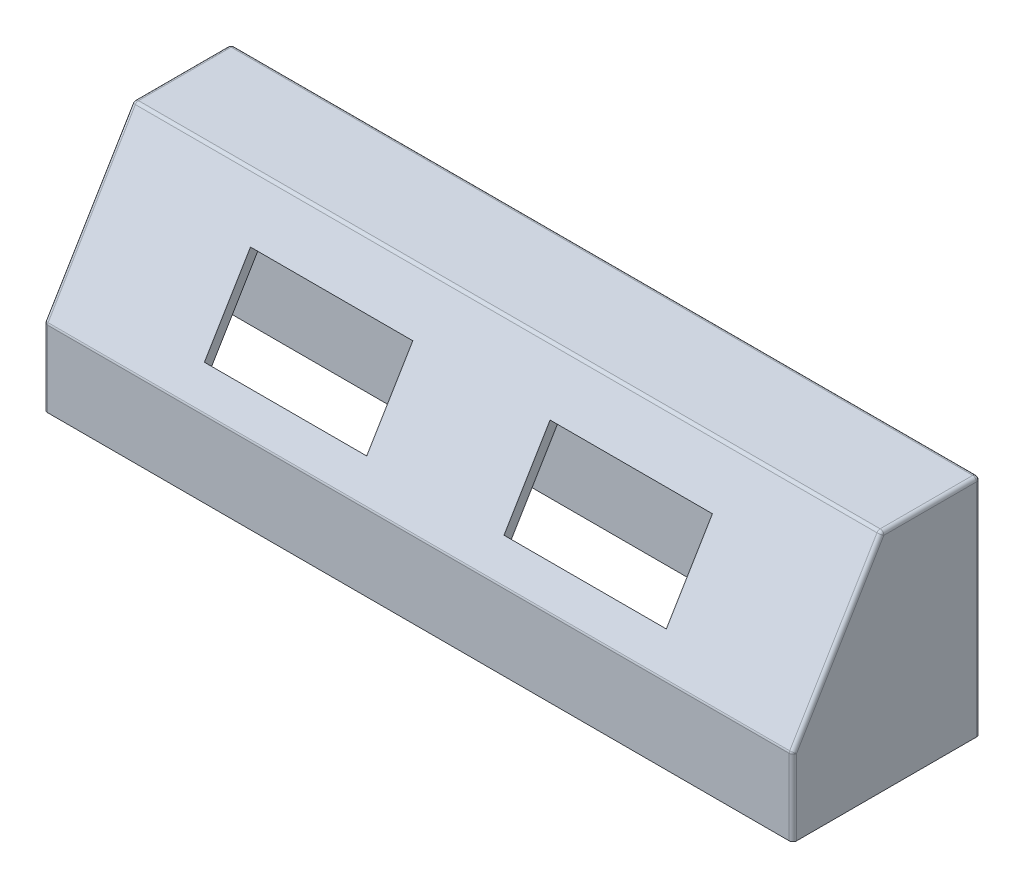
ISO-10303-21;
HEADER;
FILE_DESCRIPTION(('STEP AP214'),'2;1');
FILE_NAME('part.step','',(''),(''),'','','');
FILE_SCHEMA(('AUTOMOTIVE_DESIGN { 1 0 10303 214 1 1 1 1 }'));
ENDSEC;
DATA;
#1=APPLICATION_CONTEXT('core data for automotive mechanical design processes');
#2=APPLICATION_PROTOCOL_DEFINITION('international standard','automotive_design',2000,#1);
#3=PRODUCT_CONTEXT('',#1,'mechanical');
#4=PRODUCT('Part','Part','',(#3));
#5=PRODUCT_RELATED_PRODUCT_CATEGORY('part','',(#4));
#6=PRODUCT_DEFINITION_FORMATION('','',#4);
#7=PRODUCT_DEFINITION_CONTEXT('part definition',#1,'design');
#8=PRODUCT_DEFINITION('design','',#6,#7);
#9=PRODUCT_DEFINITION_SHAPE('','',#8);
#10=(LENGTH_UNIT() NAMED_UNIT(*) SI_UNIT(.MILLI.,.METRE.));
#11=(NAMED_UNIT(*) PLANE_ANGLE_UNIT() SI_UNIT($,.RADIAN.));
#12=(NAMED_UNIT(*) SI_UNIT($,.STERADIAN.) SOLID_ANGLE_UNIT());
#13=UNCERTAINTY_MEASURE_WITH_UNIT(LENGTH_MEASURE(1.E-05),#10,'distance_accuracy_value','');
#14=(GEOMETRIC_REPRESENTATION_CONTEXT(3) GLOBAL_UNCERTAINTY_ASSIGNED_CONTEXT((#13)) GLOBAL_UNIT_ASSIGNED_CONTEXT((#10,
#11,#12)) REPRESENTATION_CONTEXT('',''));
#15=CARTESIAN_POINT('',(0.,0.,0.));
#16=DIRECTION('',(0.,0.,1.));
#17=DIRECTION('',(1.,0.,0.));
#18=AXIS2_PLACEMENT_3D('',#15,#16,#17);
#19=CARTESIAN_POINT('',(76.2,45.72,-19.05));
#20=DIRECTION('',(-1.,0.,0.));
#21=DIRECTION('',(0.,0.,1.));
#22=AXIS2_PLACEMENT_3D('',#19,#20,#21);
#23=PLANE('',#22);
#24=DIRECTION('',(0.,0.,-1.));
#25=VECTOR('',#24,1.);
#26=CARTESIAN_POINT('',(76.2,0.,-19.05));
#27=LINE('',#26,#25);
#28=CARTESIAN_POINT('',(76.2,0.,18.288));
#29=VERTEX_POINT('',#28);
#30=CARTESIAN_POINT('',(76.2,0.,-18.288));
#31=VERTEX_POINT('',#30);
#32=EDGE_CURVE('E304',#29,#31,#27,.T.);
#33=ORIENTED_EDGE('',*,*,#32,.T.);
#34=DIRECTION('',(0.,-1.,0.));
#35=VECTOR('',#34,1.);
#36=CARTESIAN_POINT('',(76.2,45.72,-18.288));
#37=LINE('',#36,#35);
#38=CARTESIAN_POINT('',(76.2,44.958,-18.288));
#39=VERTEX_POINT('',#38);
#40=EDGE_CURVE('E404',#31,#39,#37,.F.);
#41=ORIENTED_EDGE('',*,*,#40,.T.);
#42=DIRECTION('',(0.,0.,-1.));
#43=VECTOR('',#42,1.);
#44=CARTESIAN_POINT('',(76.2,44.958,0.97068540842396));
#45=LINE('',#44,#43);
#46=CARTESIAN_POINT('',(76.2,44.958,0.539566551444894));
#47=VERTEX_POINT('',#46);
#48=EDGE_CURVE('E398',#39,#47,#45,.F.);
#49=ORIENTED_EDGE('',*,*,#48,.T.);
#50=DIRECTION('',(0.,-0.857167300702114,0.515038074910052));
#51=VECTOR('',#50,1.);
#52=CARTESIAN_POINT('',(76.2,15.238508657198,18.396838516865));
#53=LINE('',#52,#51);
#54=CARTESIAN_POINT('',(76.2,15.4196463677059,18.288));
#55=VERTEX_POINT('',#54);
#56=EDGE_CURVE('E395',#47,#55,#53,.T.);
#57=ORIENTED_EDGE('',*,*,#56,.T.);
#58=DIRECTION('',(0.,-1.,0.));
#59=VECTOR('',#58,1.);
#60=CARTESIAN_POINT('',(76.2,45.72,18.288));
#61=LINE('',#60,#59);
#62=EDGE_CURVE('E401',#55,#29,#61,.T.);
#63=ORIENTED_EDGE('',*,*,#62,.T.);
#64=EDGE_LOOP('',(#33,#41,#49,#57,#63));
#65=FACE_BOUND('',#64,.T.);
#66=ADVANCED_FACE('F49',(#65),#23,.F.);
#67=CARTESIAN_POINT('',(-76.2,45.72,-19.05));
#68=DIRECTION('',(1.,0.,0.));
#69=DIRECTION('',(0.,0.,-1.));
#70=AXIS2_PLACEMENT_3D('',#67,#68,#69);
#71=PLANE('',#70);
#72=DIRECTION('',(0.,0.,1.));
#73=VECTOR('',#72,1.);
#74=CARTESIAN_POINT('',(-76.2,44.958,-19.05));
#75=LINE('',#74,#73);
#76=CARTESIAN_POINT('',(-76.2,44.958,0.53956655144493));
#77=VERTEX_POINT('',#76);
#78=CARTESIAN_POINT('',(-76.2,44.958,-18.288));
#79=VERTEX_POINT('',#78);
#80=EDGE_CURVE('E422',#77,#79,#75,.F.);
#81=ORIENTED_EDGE('',*,*,#80,.T.);
#82=DIRECTION('',(0.,-1.,0.));
#83=VECTOR('',#82,1.);
#84=CARTESIAN_POINT('',(-76.2,45.72,-18.288));
#85=LINE('',#84,#83);
#86=CARTESIAN_POINT('',(-76.2,0.,-18.288));
#87=VERTEX_POINT('',#86);
#88=EDGE_CURVE('E425',#79,#87,#85,.T.);
#89=ORIENTED_EDGE('',*,*,#88,.T.);
#90=DIRECTION('',(0.,0.,1.));
#91=VECTOR('',#90,1.);
#92=CARTESIAN_POINT('',(-76.2,0.,-19.05));
#93=LINE('',#92,#91);
#94=CARTESIAN_POINT('',(-76.2,0.,18.288));
#95=VERTEX_POINT('',#94);
#96=EDGE_CURVE('E352',#87,#95,#93,.T.);
#97=ORIENTED_EDGE('',*,*,#96,.T.);
#98=DIRECTION('',(0.,-1.,0.));
#99=VECTOR('',#98,1.);
#100=CARTESIAN_POINT('',(-76.2,45.72,18.288));
#101=LINE('',#100,#99);
#102=CARTESIAN_POINT('',(-76.2,15.419646367706,18.288));
#103=VERTEX_POINT('',#102);
#104=EDGE_CURVE('E419',#95,#103,#101,.F.);
#105=ORIENTED_EDGE('',*,*,#104,.T.);
#106=DIRECTION('',(0.,0.857167300702114,-0.515038074910052));
#107=VECTOR('',#106,1.);
#108=CARTESIAN_POINT('',(-76.2,45.3275409869186,0.317523925288988));
#109=LINE('',#108,#107);
#110=EDGE_CURVE('E416',#103,#77,#109,.T.);
#111=ORIENTED_EDGE('',*,*,#110,.T.);
#112=EDGE_LOOP('',(#81,#89,#97,#105,#111));
#113=FACE_BOUND('',#112,.T.);
#114=ADVANCED_FACE('F576',(#113),#71,.F.);
#115=CARTESIAN_POINT('',(-76.2,45.72,19.05));
#116=DIRECTION('',(0.,0.,-1.));
#117=DIRECTION('',(-1.,0.,0.));
#118=AXIS2_PLACEMENT_3D('',#115,#116,#117);
#119=PLANE('',#118);
#120=DIRECTION('',(1.,0.,0.));
#121=VECTOR('',#120,1.);
#122=CARTESIAN_POINT('',(-76.2,0.,19.05));
#123=LINE('',#122,#121);
#124=CARTESIAN_POINT('',(-75.438,0.,19.05));
#125=VERTEX_POINT('',#124);
#126=CARTESIAN_POINT('',(75.4379999999999,0.,19.05));
#127=VERTEX_POINT('',#126);
#128=EDGE_CURVE('E356',#125,#127,#123,.T.);
#129=ORIENTED_EDGE('',*,*,#128,.T.);
#130=DIRECTION('',(0.,-1.,0.));
#131=VECTOR('',#130,1.);
#132=CARTESIAN_POINT('',(75.438,45.72,19.05));
#133=LINE('',#132,#131);
#134=CARTESIAN_POINT('',(75.438,15.4196463677059,19.05));
#135=VERTEX_POINT('',#134);
#136=EDGE_CURVE('E413',#127,#135,#133,.F.);
#137=ORIENTED_EDGE('',*,*,#136,.T.);
#138=DIRECTION('',(1.,0.,0.));
#139=VECTOR('',#138,1.);
#140=CARTESIAN_POINT('',(-76.2,15.419646367706,19.05));
#141=LINE('',#140,#139);
#142=CARTESIAN_POINT('',(-75.438,15.419646367706,19.05));
#143=VERTEX_POINT('',#142);
#144=EDGE_CURVE('E407',#135,#143,#141,.F.);
#145=ORIENTED_EDGE('',*,*,#144,.T.);
#146=DIRECTION('',(0.,-1.,0.));
#147=VECTOR('',#146,1.);
#148=CARTESIAN_POINT('',(-75.438,45.72,19.05));
#149=LINE('',#148,#147);
#150=EDGE_CURVE('E410',#143,#125,#149,.T.);
#151=ORIENTED_EDGE('',*,*,#150,.T.);
#152=EDGE_LOOP('',(#129,#137,#145,#151));
#153=FACE_BOUND('',#152,.T.);
#154=ADVANCED_FACE('F583',(#153),#119,.F.);
#155=CARTESIAN_POINT('',(0.,45.72,0.));
#156=DIRECTION('',(0.,1.,0.));
#157=DIRECTION('',(0.,0.,1.));
#158=AXIS2_PLACEMENT_3D('',#155,#156,#157);
#159=PLANE('',#158);
#160=DIRECTION('',(0.,0.,-1.));
#161=VECTOR('',#160,1.);
#162=CARTESIAN_POINT('',(75.438,45.72,-19.05));
#163=LINE('',#162,#161);
#164=CARTESIAN_POINT('',(75.438,45.72,0.539566551444891));
#165=VERTEX_POINT('',#164);
#166=CARTESIAN_POINT('',(75.438,45.72,-18.288));
#167=VERTEX_POINT('',#166);
#168=EDGE_CURVE('E366',#165,#167,#163,.T.);
#169=ORIENTED_EDGE('',*,*,#168,.T.);
#170=DIRECTION('',(-1.,0.,0.));
#171=VECTOR('',#170,1.);
#172=CARTESIAN_POINT('',(-76.2,45.72,-18.288));
#173=LINE('',#172,#171);
#174=CARTESIAN_POINT('',(-75.438,45.72,-18.288));
#175=VERTEX_POINT('',#174);
#176=EDGE_CURVE('E369',#167,#175,#173,.T.);
#177=ORIENTED_EDGE('',*,*,#176,.T.);
#178=DIRECTION('',(0.,0.,1.));
#179=VECTOR('',#178,1.);
#180=CARTESIAN_POINT('',(-75.438,45.72,0.97068540842396));
#181=LINE('',#180,#179);
#182=CARTESIAN_POINT('',(-75.438,45.72,0.539566551444928));
#183=VERTEX_POINT('',#182);
#184=EDGE_CURVE('E363',#175,#183,#181,.T.);
#185=ORIENTED_EDGE('',*,*,#184,.T.);
#186=DIRECTION('',(1.,0.,0.));
#187=VECTOR('',#186,1.);
#188=CARTESIAN_POINT('',(0.,45.72,0.53956655144491));
#189=LINE('',#188,#187);
#190=EDGE_CURVE('E360',#183,#165,#189,.T.);
#191=ORIENTED_EDGE('',*,*,#190,.T.);
#192=EDGE_LOOP('',(#169,#177,#185,#191));
#193=FACE_BOUND('',#192,.T.);
#194=ADVANCED_FACE('F897',(#193),#159,.T.);
#195=CARTESIAN_POINT('',(-76.2,45.72,-19.05));
#196=DIRECTION('',(0.,0.,1.));
#197=DIRECTION('',(1.,0.,0.));
#198=AXIS2_PLACEMENT_3D('',#195,#196,#197);
#199=PLANE('',#198);
#200=DIRECTION('',(-1.,0.,0.));
#201=VECTOR('',#200,1.);
#202=CARTESIAN_POINT('',(76.2,44.958,-19.05));
#203=LINE('',#202,#201);
#204=CARTESIAN_POINT('',(-75.438,44.958,-19.05));
#205=VERTEX_POINT('',#204);
#206=CARTESIAN_POINT('',(75.438,44.958,-19.05));
#207=VERTEX_POINT('',#206);
#208=EDGE_CURVE('E376',#205,#207,#203,.F.);
#209=ORIENTED_EDGE('',*,*,#208,.T.);
#210=DIRECTION('',(0.,-1.,0.));
#211=VECTOR('',#210,1.);
#212=CARTESIAN_POINT('',(75.438,45.72,-19.05));
#213=LINE('',#212,#211);
#214=CARTESIAN_POINT('',(75.438,0.,-19.05));
#215=VERTEX_POINT('',#214);
#216=EDGE_CURVE('E380',#207,#215,#213,.T.);
#217=ORIENTED_EDGE('',*,*,#216,.T.);
#218=DIRECTION('',(-1.,0.,0.));
#219=VECTOR('',#218,1.);
#220=CARTESIAN_POINT('',(-76.2,0.,-19.05));
#221=LINE('',#220,#219);
#222=CARTESIAN_POINT('',(-75.438,0.,-19.05));
#223=VERTEX_POINT('',#222);
#224=EDGE_CURVE('E348',#215,#223,#221,.T.);
#225=ORIENTED_EDGE('',*,*,#224,.T.);
#226=DIRECTION('',(0.,-1.,0.));
#227=VECTOR('',#226,1.);
#228=CARTESIAN_POINT('',(-75.438,45.72,-19.05));
#229=LINE('',#228,#227);
#230=EDGE_CURVE('E373',#223,#205,#229,.F.);
#231=ORIENTED_EDGE('',*,*,#230,.T.);
#232=EDGE_LOOP('',(#209,#217,#225,#231));
#233=FACE_BOUND('',#232,.T.);
#234=ADVANCED_FACE('F588',(#233),#199,.F.);
#235=CARTESIAN_POINT('',(0.,0.,0.));
#236=DIRECTION('',(0.,1.,0.));
#237=DIRECTION('',(0.,0.,1.));
#238=AXIS2_PLACEMENT_3D('',#235,#236,#237);
#239=PLANE('',#238);
#240=DIRECTION('',(1.,0.,0.));
#241=VECTOR('',#240,1.);
#242=CARTESIAN_POINT('',(-76.2,0.,17.018));
#243=LINE('',#242,#241);
#244=CARTESIAN_POINT('',(-74.168,0.,17.018));
#245=VERTEX_POINT('',#244);
#246=CARTESIAN_POINT('',(74.168,0.,17.018));
#247=VERTEX_POINT('',#246);
#248=EDGE_CURVE('E310',#245,#247,#243,.T.);
#249=ORIENTED_EDGE('',*,*,#248,.T.);
#250=DIRECTION('',(0.,0.,-1.));
#251=VECTOR('',#250,1.);
#252=CARTESIAN_POINT('',(74.168,0.,-19.05));
#253=LINE('',#252,#251);
#254=CARTESIAN_POINT('',(74.168,0.,-17.018));
#255=VERTEX_POINT('',#254);
#256=EDGE_CURVE('E314',#247,#255,#253,.T.);
#257=ORIENTED_EDGE('',*,*,#256,.T.);
#258=DIRECTION('',(-1.,0.,0.));
#259=VECTOR('',#258,1.);
#260=CARTESIAN_POINT('',(-76.2,0.,-17.018));
#261=LINE('',#260,#259);
#262=CARTESIAN_POINT('',(-74.168,0.,-17.018));
#263=VERTEX_POINT('',#262);
#264=EDGE_CURVE('E334',#255,#263,#261,.T.);
#265=ORIENTED_EDGE('',*,*,#264,.T.);
#266=DIRECTION('',(0.,0.,1.));
#267=VECTOR('',#266,1.);
#268=CARTESIAN_POINT('',(-74.168,0.,-19.05));
#269=LINE('',#268,#267);
#270=EDGE_CURVE('E338',#263,#245,#269,.T.);
#271=ORIENTED_EDGE('',*,*,#270,.T.);
#272=EDGE_LOOP('',(#249,#257,#265,#271));
#273=FACE_BOUND('',#272,.T.);
#274=ORIENTED_EDGE('',*,*,#224,.F.);
#275=CARTESIAN_POINT('',(75.438,0.,-18.288));
#276=DIRECTION('',(0.,1.,0.));
#277=DIRECTION('',(0.,0.,1.));
#278=AXIS2_PLACEMENT_3D('',#275,#276,#277);
#279=CIRCLE('',#278,0.762);
#280=EDGE_CURVE('E392',#215,#31,#279,.F.);
#281=ORIENTED_EDGE('',*,*,#280,.T.);
#282=ORIENTED_EDGE('',*,*,#32,.F.);
#283=CARTESIAN_POINT('',(75.438,0.,18.288));
#284=DIRECTION('',(0.,1.,0.));
#285=DIRECTION('',(0.,0.,1.));
#286=AXIS2_PLACEMENT_3D('',#283,#284,#285);
#287=CIRCLE('',#286,0.762);
#288=EDGE_CURVE('E389',#29,#127,#287,.F.);
#289=ORIENTED_EDGE('',*,*,#288,.T.);
#290=ORIENTED_EDGE('',*,*,#128,.F.);
#291=CARTESIAN_POINT('',(-75.438,0.,18.288));
#292=DIRECTION('',(0.,1.,0.));
#293=DIRECTION('',(0.,0.,1.));
#294=AXIS2_PLACEMENT_3D('',#291,#292,#293);
#295=CIRCLE('',#294,0.762);
#296=EDGE_CURVE('E386',#125,#95,#295,.F.);
#297=ORIENTED_EDGE('',*,*,#296,.T.);
#298=ORIENTED_EDGE('',*,*,#96,.F.);
#299=CARTESIAN_POINT('',(-75.438,0.,-18.288));
#300=DIRECTION('',(0.,1.,0.));
#301=DIRECTION('',(0.,0.,1.));
#302=AXIS2_PLACEMENT_3D('',#299,#300,#301);
#303=CIRCLE('',#302,0.762);
#304=EDGE_CURVE('E383',#87,#223,#303,.F.);
#305=ORIENTED_EDGE('',*,*,#304,.T.);
#306=EDGE_LOOP('',(#274,#281,#282,#289,#290,#297,#298,#305));
#307=FACE_BOUND('',#306,.T.);
#308=ADVANCED_FACE('F565',(#273,#307),#239,.F.);
#309=CARTESIAN_POINT('',(-76.201,12.55641224711,20.8973792748002));
#310=DIRECTION('',(0.,0.515038074910052,0.857167300702114));
#311=DIRECTION('',(0.,-0.857167300702114,0.515038074910052));
#312=AXIS2_PLACEMENT_3D('',#309,#310,#311);
#313=PLANE('',#312);
#314=DIRECTION('',(1.,0.,0.));
#315=VECTOR('',#314,1.);
#316=CARTESIAN_POINT('',(76.2,15.8121053807874,18.941161483135));
#317=LINE('',#316,#315);
#318=CARTESIAN_POINT('',(-75.438,15.8121053807874,18.941161483135));
#319=VERTEX_POINT('',#318);
#320=CARTESIAN_POINT('',(75.438,15.8121053807874,18.941161483135));
#321=VERTEX_POINT('',#320);
#322=EDGE_CURVE('E428',#319,#321,#317,.T.);
#323=ORIENTED_EDGE('',*,*,#322,.T.);
#324=DIRECTION('',(0.,-0.857167300702114,0.515038074910052));
#325=VECTOR('',#324,1.);
#326=CARTESIAN_POINT('',(75.438,45.72,0.970685408423971));
#327=LINE('',#326,#325);
#328=CARTESIAN_POINT('',(75.438,45.3504590130815,1.1927280345799));
#329=VERTEX_POINT('',#328);
#330=EDGE_CURVE('E437',#321,#329,#327,.F.);
#331=ORIENTED_EDGE('',*,*,#330,.T.);
#332=DIRECTION('',(1.,0.,0.));
#333=VECTOR('',#332,1.);
#334=CARTESIAN_POINT('',(-76.201,45.3504590130815,1.19272803457994));
#335=LINE('',#334,#333);
#336=CARTESIAN_POINT('',(-75.438,45.3504590130815,1.19272803457994));
#337=VERTEX_POINT('',#336);
#338=EDGE_CURVE('E434',#329,#337,#335,.F.);
#339=ORIENTED_EDGE('',*,*,#338,.T.);
#340=DIRECTION('',(0.,0.857167300702114,-0.515038074910052));
#341=VECTOR('',#340,1.);
#342=CARTESIAN_POINT('',(-75.438,15.6309676702795,19.05));
#343=LINE('',#342,#341);
#344=EDGE_CURVE('E431',#337,#319,#343,.F.);
#345=ORIENTED_EDGE('',*,*,#344,.T.);
#346=EDGE_LOOP('',(#323,#331,#339,#345));
#347=FACE_BOUND('',#346,.T.);
#348=DIRECTION('',(1.,0.,0.));
#349=VECTOR('',#348,1.);
#350=CARTESIAN_POINT('',(-76.201,21.3819181634015,15.5944803267059));
#351=LINE('',#350,#349);
#352=CARTESIAN_POINT('',(-13.97,21.3819181634015,15.5944803267059));
#353=VERTEX_POINT('',#352);
#354=CARTESIAN_POINT('',(-46.99,21.3819181634015,15.5944803267059));
#355=VERTEX_POINT('',#354);
#356=EDGE_CURVE('E441',#353,#355,#351,.F.);
#357=ORIENTED_EDGE('',*,*,#356,.T.);
#358=DIRECTION('',(0.,-0.857167300702114,0.515038074910052));
#359=VECTOR('',#358,1.);
#360=CARTESIAN_POINT('',(-46.99,36.9893781721115,6.21657224442457));
#361=LINE('',#360,#359);
#362=CARTESIAN_POINT('',(-46.99,36.9893781721115,6.21657224442457));
#363=VERTEX_POINT('',#362);
#364=EDGE_CURVE('E240',#363,#355,#361,.T.);
#365=ORIENTED_EDGE('',*,*,#364,.F.);
#366=DIRECTION('',(-1.,0.,0.));
#367=VECTOR('',#366,1.);
#368=CARTESIAN_POINT('',(-46.99,36.9893781721115,6.21657224442457));
#369=LINE('',#368,#367);
#370=CARTESIAN_POINT('',(-13.97,36.9893781721115,6.21657224442456));
#371=VERTEX_POINT('',#370);
#372=EDGE_CURVE('E232',#371,#363,#369,.T.);
#373=ORIENTED_EDGE('',*,*,#372,.F.);
#374=DIRECTION('',(0.,0.857167300702114,-0.515038074910052));
#375=VECTOR('',#374,1.);
#376=CARTESIAN_POINT('',(-13.97,36.9893781721115,6.21657224442456));
#377=LINE('',#376,#375);
#378=EDGE_CURVE('E242',#353,#371,#377,.T.);
#379=ORIENTED_EDGE('',*,*,#378,.F.);
#380=EDGE_LOOP('',(#357,#365,#373,#379));
#381=FACE_BOUND('',#380,.T.);
#382=DIRECTION('',(1.,0.,0.));
#383=VECTOR('',#382,1.);
#384=CARTESIAN_POINT('',(-76.201,21.3819181634015,15.5944803267059));
#385=LINE('',#384,#383);
#386=CARTESIAN_POINT('',(46.99,21.3819181634015,15.5944803267059));
#387=VERTEX_POINT('',#386);
#388=CARTESIAN_POINT('',(13.97,21.3819181634015,15.5944803267059));
#389=VERTEX_POINT('',#388);
#390=EDGE_CURVE('E512',#387,#389,#385,.F.);
#391=ORIENTED_EDGE('',*,*,#390,.T.);
#392=DIRECTION('',(0.,-0.857167300702114,0.515038074910052));
#393=VECTOR('',#392,1.);
#394=CARTESIAN_POINT('',(13.97,36.9893781721115,6.21657224442455));
#395=LINE('',#394,#393);
#396=CARTESIAN_POINT('',(13.97,36.9893781721115,6.21657224442455));
#397=VERTEX_POINT('',#396);
#398=EDGE_CURVE('E272',#397,#389,#395,.T.);
#399=ORIENTED_EDGE('',*,*,#398,.F.);
#400=DIRECTION('',(-1.,0.,0.));
#401=VECTOR('',#400,1.);
#402=CARTESIAN_POINT('',(46.99,36.9893781721115,6.21657224442455));
#403=LINE('',#402,#401);
#404=CARTESIAN_POINT('',(46.99,36.9893781721115,6.21657224442455));
#405=VERTEX_POINT('',#404);
#406=EDGE_CURVE('E277',#405,#397,#403,.T.);
#407=ORIENTED_EDGE('',*,*,#406,.F.);
#408=DIRECTION('',(0.,0.857167300702114,-0.515038074910052));
#409=VECTOR('',#408,1.);
#410=CARTESIAN_POINT('',(46.99,36.9893781721115,6.21657224442455));
#411=LINE('',#410,#409);
#412=EDGE_CURVE('E281',#387,#405,#411,.T.);
#413=ORIENTED_EDGE('',*,*,#412,.F.);
#414=EDGE_LOOP('',(#391,#399,#407,#413));
#415=FACE_BOUND('',#414,.T.);
#416=ADVANCED_FACE('F251',(#347,#381,#415),#313,.T.);
#417=CARTESIAN_POINT('',(74.168,45.72,-19.05));
#418=DIRECTION('',(-1.,0.,0.));
#419=DIRECTION('',(0.,0.,1.));
#420=AXIS2_PLACEMENT_3D('',#417,#418,#419);
#421=PLANE('',#420);
#422=DIRECTION('',(0.,-0.857167300702114,0.515038074910052));
#423=VECTOR('',#422,1.);
#424=CARTESIAN_POINT('',(74.168,11.5098548788928,19.1556153197734));
#425=LINE('',#424,#423);
#426=CARTESIAN_POINT('',(74.168,43.688,-0.178964876853573));
#427=VERTEX_POINT('',#426);
#428=CARTESIAN_POINT('',(74.168,15.0674441967499,17.018));
#429=VERTEX_POINT('',#428);
#430=EDGE_CURVE('E290',#427,#429,#425,.T.);
#431=ORIENTED_EDGE('',*,*,#430,.F.);
#432=DIRECTION('',(0.,0.,-1.));
#433=VECTOR('',#432,1.);
#434=CARTESIAN_POINT('',(74.168,43.688,-19.05));
#435=LINE('',#434,#433);
#436=CARTESIAN_POINT('',(74.168,43.688,-17.018));
#437=VERTEX_POINT('',#436);
#438=EDGE_CURVE('E306',#427,#437,#435,.T.);
#439=ORIENTED_EDGE('',*,*,#438,.T.);
#440=DIRECTION('',(0.,-1.,0.));
#441=VECTOR('',#440,1.);
#442=CARTESIAN_POINT('',(74.168,45.72,-17.018));
#443=LINE('',#442,#441);
#444=EDGE_CURVE('E300',#437,#255,#443,.T.);
#445=ORIENTED_EDGE('',*,*,#444,.T.);
#446=ORIENTED_EDGE('',*,*,#256,.F.);
#447=DIRECTION('',(0.,-1.,0.));
#448=VECTOR('',#447,1.);
#449=CARTESIAN_POINT('',(74.168,45.72,17.018));
#450=LINE('',#449,#448);
#451=EDGE_CURVE('E295',#429,#247,#450,.T.);
#452=ORIENTED_EDGE('',*,*,#451,.F.);
#453=EDGE_LOOP('',(#431,#439,#445,#446,#452));
#454=FACE_BOUND('',#453,.T.);
#455=ADVANCED_FACE('F562',(#454),#421,.T.);
#456=CARTESIAN_POINT('',(-74.168,45.72,-19.05));
#457=DIRECTION('',(1.,0.,0.));
#458=DIRECTION('',(0.,0.,-1.));
#459=AXIS2_PLACEMENT_3D('',#456,#457,#458);
#460=PLANE('',#459);
#461=DIRECTION('',(0.,0.857167300702114,-0.515038074910052));
#462=VECTOR('',#461,1.);
#463=CARTESIAN_POINT('',(-74.168,11.5098548788928,19.1556153197735));
#464=LINE('',#463,#462);
#465=CARTESIAN_POINT('',(-74.168,15.06744419675,17.018));
#466=VERTEX_POINT('',#465);
#467=CARTESIAN_POINT('',(-74.168,43.688,-0.178964876853542));
#468=VERTEX_POINT('',#467);
#469=EDGE_CURVE('E263',#466,#468,#464,.T.);
#470=ORIENTED_EDGE('',*,*,#469,.F.);
#471=DIRECTION('',(0.,-1.,0.));
#472=VECTOR('',#471,1.);
#473=CARTESIAN_POINT('',(-74.168,45.72,17.018));
#474=LINE('',#473,#472);
#475=EDGE_CURVE('E298',#466,#245,#474,.T.);
#476=ORIENTED_EDGE('',*,*,#475,.T.);
#477=ORIENTED_EDGE('',*,*,#270,.F.);
#478=DIRECTION('',(0.,-1.,0.));
#479=VECTOR('',#478,1.);
#480=CARTESIAN_POINT('',(-74.168,45.72,-17.018));
#481=LINE('',#480,#479);
#482=CARTESIAN_POINT('',(-74.168,43.688,-17.018));
#483=VERTEX_POINT('',#482);
#484=EDGE_CURVE('E305',#483,#263,#481,.T.);
#485=ORIENTED_EDGE('',*,*,#484,.F.);
#486=DIRECTION('',(0.,0.,1.));
#487=VECTOR('',#486,1.);
#488=CARTESIAN_POINT('',(-74.168,43.688,-19.05));
#489=LINE('',#488,#487);
#490=EDGE_CURVE('E299',#483,#468,#489,.T.);
#491=ORIENTED_EDGE('',*,*,#490,.T.);
#492=EDGE_LOOP('',(#470,#476,#477,#485,#491));
#493=FACE_BOUND('',#492,.T.);
#494=ADVANCED_FACE('F553',(#493),#460,.T.);
#495=CARTESIAN_POINT('',(-76.2,45.72,17.018));
#496=DIRECTION('',(0.,0.,-1.));
#497=DIRECTION('',(-1.,0.,0.));
#498=AXIS2_PLACEMENT_3D('',#495,#496,#497);
#499=PLANE('',#498);
#500=DIRECTION('',(1.,0.,0.));
#501=VECTOR('',#500,1.);
#502=CARTESIAN_POINT('',(-76.2,15.06744419675,17.018));
#503=LINE('',#502,#501);
#504=EDGE_CURVE('E311',#466,#429,#503,.T.);
#505=ORIENTED_EDGE('',*,*,#504,.T.);
#506=ORIENTED_EDGE('',*,*,#451,.T.);
#507=ORIENTED_EDGE('',*,*,#248,.F.);
#508=ORIENTED_EDGE('',*,*,#475,.F.);
#509=EDGE_LOOP('',(#505,#506,#507,#508));
#510=FACE_BOUND('',#509,.T.);
#511=ADVANCED_FACE('F551',(#510),#499,.T.);
#512=CARTESIAN_POINT('',(0.,43.688,0.));
#513=DIRECTION('',(0.,1.,0.));
#514=DIRECTION('',(0.,0.,1.));
#515=AXIS2_PLACEMENT_3D('',#512,#513,#514);
#516=PLANE('',#515);
#517=ORIENTED_EDGE('',*,*,#490,.F.);
#518=DIRECTION('',(-1.,0.,0.));
#519=VECTOR('',#518,1.);
#520=CARTESIAN_POINT('',(-76.2,43.688,-17.018));
#521=LINE('',#520,#519);
#522=EDGE_CURVE('E309',#437,#483,#521,.T.);
#523=ORIENTED_EDGE('',*,*,#522,.F.);
#524=ORIENTED_EDGE('',*,*,#438,.F.);
#525=DIRECTION('',(1.,0.,0.));
#526=VECTOR('',#525,1.);
#527=CARTESIAN_POINT('',(0.,43.688,-0.178964876853564));
#528=LINE('',#527,#526);
#529=EDGE_CURVE('E294',#468,#427,#528,.T.);
#530=ORIENTED_EDGE('',*,*,#529,.F.);
#531=EDGE_LOOP('',(#517,#523,#524,#530));
#532=FACE_BOUND('',#531,.T.);
#533=ADVANCED_FACE('F558',(#532),#516,.F.);
#534=CARTESIAN_POINT('',(-76.2,45.72,-17.018));
#535=DIRECTION('',(0.,0.,1.));
#536=DIRECTION('',(1.,0.,0.));
#537=AXIS2_PLACEMENT_3D('',#534,#535,#536);
#538=PLANE('',#537);
#539=ORIENTED_EDGE('',*,*,#264,.F.);
#540=ORIENTED_EDGE('',*,*,#444,.F.);
#541=ORIENTED_EDGE('',*,*,#522,.T.);
#542=ORIENTED_EDGE('',*,*,#484,.T.);
#543=EDGE_LOOP('',(#539,#540,#541,#542));
#544=FACE_BOUND('',#543,.T.);
#545=ADVANCED_FACE('F543',(#544),#538,.T.);
#546=CARTESIAN_POINT('',(-76.201,11.5098548788928,19.1556153197735));
#547=DIRECTION('',(0.,0.515038074910052,0.857167300702114));
#548=DIRECTION('',(0.,-0.857167300702114,0.515038074910052));
#549=AXIS2_PLACEMENT_3D('',#546,#547,#548);
#550=PLANE('',#549);
#551=DIRECTION('',(0.,0.857167300702114,-0.515038074910052));
#552=VECTOR('',#551,1.);
#553=CARTESIAN_POINT('',(-46.99,35.9428208038943,4.47480828939787));
#554=LINE('',#553,#552);
#555=CARTESIAN_POINT('',(-46.99,17.4365787817357,15.5944803267059));
#556=VERTEX_POINT('',#555);
#557=CARTESIAN_POINT('',(-46.99,35.9428208038943,4.47480828939786));
#558=VERTEX_POINT('',#557);
#559=EDGE_CURVE('E289',#556,#558,#554,.T.);
#560=ORIENTED_EDGE('',*,*,#559,.F.);
#561=DIRECTION('',(1.,0.,0.));
#562=VECTOR('',#561,1.);
#563=CARTESIAN_POINT('',(-76.201,17.4365787817357,15.5944803267059));
#564=LINE('',#563,#562);
#565=CARTESIAN_POINT('',(-13.97,17.4365787817357,15.5944803267059));
#566=VERTEX_POINT('',#565);
#567=EDGE_CURVE('E516',#556,#566,#564,.T.);
#568=ORIENTED_EDGE('',*,*,#567,.T.);
#569=DIRECTION('',(0.,-0.857167300702114,0.515038074910052));
#570=VECTOR('',#569,1.);
#571=CARTESIAN_POINT('',(-13.97,35.9428208038943,4.47480828939785));
#572=LINE('',#571,#570);
#573=CARTESIAN_POINT('',(-13.97,35.9428208038943,4.47480828939785));
#574=VERTEX_POINT('',#573);
#575=EDGE_CURVE('E249',#574,#566,#572,.T.);
#576=ORIENTED_EDGE('',*,*,#575,.F.);
#577=DIRECTION('',(1.,0.,0.));
#578=VECTOR('',#577,1.);
#579=CARTESIAN_POINT('',(-46.99,35.9428208038943,4.47480828939787));
#580=LINE('',#579,#578);
#581=EDGE_CURVE('E235',#558,#574,#580,.T.);
#582=ORIENTED_EDGE('',*,*,#581,.F.);
#583=EDGE_LOOP('',(#560,#568,#576,#582));
#584=FACE_BOUND('',#583,.T.);
#585=DIRECTION('',(0.,0.857167300702114,-0.515038074910052));
#586=VECTOR('',#585,1.);
#587=CARTESIAN_POINT('',(13.97,35.9428208038943,4.47480828939786));
#588=LINE('',#587,#586);
#589=CARTESIAN_POINT('',(13.97,17.4365787817357,15.5944803267059));
#590=VERTEX_POINT('',#589);
#591=CARTESIAN_POINT('',(13.97,35.9428208038943,4.47480828939784));
#592=VERTEX_POINT('',#591);
#593=EDGE_CURVE('E66',#590,#592,#588,.T.);
#594=ORIENTED_EDGE('',*,*,#593,.F.);
#595=DIRECTION('',(1.,0.,0.));
#596=VECTOR('',#595,1.);
#597=CARTESIAN_POINT('',(-76.201,17.4365787817357,15.5944803267059));
#598=LINE('',#597,#596);
#599=CARTESIAN_POINT('',(46.99,17.4365787817357,15.5944803267059));
#600=VERTEX_POINT('',#599);
#601=EDGE_CURVE('E520',#590,#600,#598,.T.);
#602=ORIENTED_EDGE('',*,*,#601,.T.);
#603=DIRECTION('',(0.,-0.857167300702114,0.515038074910052));
#604=VECTOR('',#603,1.);
#605=CARTESIAN_POINT('',(46.99,35.9428208038943,4.47480828939785));
#606=LINE('',#605,#604);
#607=CARTESIAN_POINT('',(46.99,35.9428208038943,4.47480828939784));
#608=VERTEX_POINT('',#607);
#609=EDGE_CURVE('E74',#608,#600,#606,.T.);
#610=ORIENTED_EDGE('',*,*,#609,.F.);
#611=DIRECTION('',(1.,0.,0.));
#612=VECTOR('',#611,1.);
#613=CARTESIAN_POINT('',(46.99,35.9428208038943,4.47480828939785));
#614=LINE('',#613,#612);
#615=EDGE_CURVE('E264',#592,#608,#614,.T.);
#616=ORIENTED_EDGE('',*,*,#615,.F.);
#617=EDGE_LOOP('',(#594,#602,#610,#616));
#618=FACE_BOUND('',#617,.T.);
#619=ORIENTED_EDGE('',*,*,#504,.F.);
#620=ORIENTED_EDGE('',*,*,#469,.T.);
#621=ORIENTED_EDGE('',*,*,#529,.T.);
#622=ORIENTED_EDGE('',*,*,#430,.T.);
#623=EDGE_LOOP('',(#619,#620,#621,#622));
#624=FACE_BOUND('',#623,.T.);
#625=ADVANCED_FACE('F537',(#584,#618,#624),#550,.F.);
#626=CARTESIAN_POINT('',(46.99,16.0221833650052,-28.6786998754891));
#627=DIRECTION('',(0.,0.857167300702114,-0.515038074910052));
#628=DIRECTION('',(0.,0.515038074910052,0.857167300702114));
#629=AXIS2_PLACEMENT_3D('',#626,#627,#628);
#630=PLANE('',#629);
#631=ORIENTED_EDGE('',*,*,#615,.T.);
#632=DIRECTION('',(0.,0.515038074910052,0.857167300702114));
#633=VECTOR('',#632,1.);
#634=CARTESIAN_POINT('',(46.99,16.0221833650052,-28.6786998754891));
#635=LINE('',#634,#633);
#636=EDGE_CURVE('E269',#608,#405,#635,.T.);
#637=ORIENTED_EDGE('',*,*,#636,.T.);
#638=ORIENTED_EDGE('',*,*,#406,.T.);
#639=DIRECTION('',(0.,0.515038074910052,0.857167300702114));
#640=VECTOR('',#639,1.);
#641=CARTESIAN_POINT('',(13.97,16.0221833650052,-28.6786998754891));
#642=LINE('',#641,#640);
#643=EDGE_CURVE('E267',#592,#397,#642,.T.);
#644=ORIENTED_EDGE('',*,*,#643,.F.);
#645=EDGE_LOOP('',(#631,#637,#638,#644));
#646=FACE_BOUND('',#645,.T.);
#647=ADVANCED_FACE('F542',(#646),#630,.F.);
#648=CARTESIAN_POINT('',(13.97,16.0221833650052,-28.6786998754891));
#649=DIRECTION('',(-1.,0.,0.));
#650=DIRECTION('',(0.,-1.,0.));
#651=AXIS2_PLACEMENT_3D('',#648,#649,#650);
#652=PLANE('',#651);
#653=ORIENTED_EDGE('',*,*,#593,.T.);
#654=ORIENTED_EDGE('',*,*,#643,.T.);
#655=ORIENTED_EDGE('',*,*,#398,.T.);
#656=DIRECTION('',(0.,1.,0.));
#657=VECTOR('',#656,1.);
#658=CARTESIAN_POINT('',(13.97,16.0221833650047,15.5944803267059));
#659=LINE('',#658,#657);
#660=EDGE_CURVE('E523',#389,#590,#659,.F.);
#661=ORIENTED_EDGE('',*,*,#660,.T.);
#662=EDGE_LOOP('',(#653,#654,#655,#661));
#663=FACE_BOUND('',#662,.T.);
#664=ADVANCED_FACE('F674',(#663),#652,.F.);
#665=CARTESIAN_POINT('',(46.99,16.0221833650052,-28.6786998754891));
#666=DIRECTION('',(1.,0.,0.));
#667=DIRECTION('',(0.,0.,-1.));
#668=AXIS2_PLACEMENT_3D('',#665,#666,#667);
#669=PLANE('',#668);
#670=ORIENTED_EDGE('',*,*,#609,.T.);
#671=DIRECTION('',(0.,-1.,0.));
#672=VECTOR('',#671,1.);
#673=CARTESIAN_POINT('',(46.99,16.0221833650047,15.5944803267059));
#674=LINE('',#673,#672);
#675=EDGE_CURVE('E526',#600,#387,#674,.F.);
#676=ORIENTED_EDGE('',*,*,#675,.T.);
#677=ORIENTED_EDGE('',*,*,#412,.T.);
#678=ORIENTED_EDGE('',*,*,#636,.F.);
#679=EDGE_LOOP('',(#670,#676,#677,#678));
#680=FACE_BOUND('',#679,.T.);
#681=ADVANCED_FACE('F670',(#680),#669,.F.);
#682=CARTESIAN_POINT('',(-46.99,16.0221833650052,-28.6786998754891));
#683=DIRECTION('',(0.,0.857167300702114,-0.515038074910052));
#684=DIRECTION('',(0.,0.515038074910052,0.857167300702114));
#685=AXIS2_PLACEMENT_3D('',#682,#683,#684);
#686=PLANE('',#685);
#687=ORIENTED_EDGE('',*,*,#581,.T.);
#688=DIRECTION('',(0.,0.515038074910052,0.857167300702114));
#689=VECTOR('',#688,1.);
#690=CARTESIAN_POINT('',(-13.97,16.0221833650052,-28.6786998754891));
#691=LINE('',#690,#689);
#692=EDGE_CURVE('E228',#574,#371,#691,.T.);
#693=ORIENTED_EDGE('',*,*,#692,.T.);
#694=ORIENTED_EDGE('',*,*,#372,.T.);
#695=DIRECTION('',(0.,0.515038074910052,0.857167300702114));
#696=VECTOR('',#695,1.);
#697=CARTESIAN_POINT('',(-46.99,16.0221833650052,-28.6786998754891));
#698=LINE('',#697,#696);
#699=EDGE_CURVE('E239',#558,#363,#698,.T.);
#700=ORIENTED_EDGE('',*,*,#699,.F.);
#701=EDGE_LOOP('',(#687,#693,#694,#700));
#702=FACE_BOUND('',#701,.T.);
#703=ADVANCED_FACE('F230',(#702),#686,.F.);
#704=CARTESIAN_POINT('',(-46.99,16.0221833650052,-28.6786998754891));
#705=DIRECTION('',(-1.,0.,0.));
#706=DIRECTION('',(0.,-1.,0.));
#707=AXIS2_PLACEMENT_3D('',#704,#705,#706);
#708=PLANE('',#707);
#709=ORIENTED_EDGE('',*,*,#559,.T.);
#710=ORIENTED_EDGE('',*,*,#699,.T.);
#711=ORIENTED_EDGE('',*,*,#364,.T.);
#712=DIRECTION('',(0.,1.,0.));
#713=VECTOR('',#712,1.);
#714=CARTESIAN_POINT('',(-46.99,16.0221833650047,15.5944803267059));
#715=LINE('',#714,#713);
#716=EDGE_CURVE('E59',#355,#556,#715,.F.);
#717=ORIENTED_EDGE('',*,*,#716,.T.);
#718=EDGE_LOOP('',(#709,#710,#711,#717));
#719=FACE_BOUND('',#718,.T.);
#720=ADVANCED_FACE('F534',(#719),#708,.F.);
#721=CARTESIAN_POINT('',(-13.97,16.0221833650052,-28.6786998754891));
#722=DIRECTION('',(1.,0.,0.));
#723=DIRECTION('',(0.,1.,0.));
#724=AXIS2_PLACEMENT_3D('',#721,#722,#723);
#725=PLANE('',#724);
#726=ORIENTED_EDGE('',*,*,#575,.T.);
#727=DIRECTION('',(0.,-1.,0.));
#728=VECTOR('',#727,1.);
#729=CARTESIAN_POINT('',(-13.97,16.0221833650047,15.5944803267059));
#730=LINE('',#729,#728);
#731=EDGE_CURVE('E11',#566,#353,#730,.F.);
#732=ORIENTED_EDGE('',*,*,#731,.T.);
#733=ORIENTED_EDGE('',*,*,#378,.T.);
#734=ORIENTED_EDGE('',*,*,#692,.F.);
#735=EDGE_LOOP('',(#726,#732,#733,#734));
#736=FACE_BOUND('',#735,.T.);
#737=ADVANCED_FACE('F243',(#736),#725,.F.);
#738=CARTESIAN_POINT('',(75.438,45.72,18.288));
#739=DIRECTION('',(0.,-1.,0.));
#740=DIRECTION('',(0.,0.,-1.));
#741=AXIS2_PLACEMENT_3D('',#738,#739,#740);
#742=CYLINDRICAL_SURFACE('',#741,0.762);
#743=ORIENTED_EDGE('',*,*,#288,.F.);
#744=ORIENTED_EDGE('',*,*,#62,.F.);
#745=CARTESIAN_POINT('',(75.438,15.4196463677059,18.288));
#746=DIRECTION('',(0.,1.,0.));
#747=DIRECTION('',(-1.,0.,0.));
#748=AXIS2_PLACEMENT_3D('',#745,#746,#747);
#749=CIRCLE('',#748,0.762);
#750=EDGE_CURVE('E268',#135,#55,#749,.T.);
#751=ORIENTED_EDGE('',*,*,#750,.F.);
#752=ORIENTED_EDGE('',*,*,#136,.F.);
#753=EDGE_LOOP('',(#743,#744,#751,#752));
#754=FACE_BOUND('',#753,.T.);
#755=ADVANCED_FACE('F653',(#754),#742,.T.);
#756=CARTESIAN_POINT('',(-76.201,15.419646367706,18.288));
#757=DIRECTION('',(-1.,0.,0.));
#758=DIRECTION('',(0.,-1.,0.));
#759=AXIS2_PLACEMENT_3D('',#756,#757,#758);
#760=CYLINDRICAL_SURFACE('',#759,0.762);
#761=CARTESIAN_POINT('',(-75.438,15.419646367706,18.288));
#762=DIRECTION('',(-1.,0.,0.));
#763=DIRECTION('',(0.,0.,1.));
#764=AXIS2_PLACEMENT_3D('',#761,#762,#763);
#765=CIRCLE('',#764,0.762);
#766=EDGE_CURVE('E499',#143,#319,#765,.T.);
#767=ORIENTED_EDGE('',*,*,#766,.F.);
#768=ORIENTED_EDGE('',*,*,#144,.F.);
#769=CARTESIAN_POINT('',(75.438,15.4196463677059,18.288));
#770=DIRECTION('',(1.,0.,0.));
#771=DIRECTION('',(0.,0.,-1.));
#772=AXIS2_PLACEMENT_3D('',#769,#770,#771);
#773=CIRCLE('',#772,0.762);
#774=EDGE_CURVE('E503',#321,#135,#773,.T.);
#775=ORIENTED_EDGE('',*,*,#774,.F.);
#776=ORIENTED_EDGE('',*,*,#322,.F.);
#777=EDGE_LOOP('',(#767,#768,#775,#776));
#778=FACE_BOUND('',#777,.T.);
#779=ADVANCED_FACE('F649',(#778),#760,.T.);
#780=CARTESIAN_POINT('',(-75.438,45.72,18.288));
#781=DIRECTION('',(0.,-1.,0.));
#782=DIRECTION('',(0.,0.,-1.));
#783=AXIS2_PLACEMENT_3D('',#780,#781,#782);
#784=CYLINDRICAL_SURFACE('',#783,0.762);
#785=ORIENTED_EDGE('',*,*,#296,.F.);
#786=ORIENTED_EDGE('',*,*,#150,.F.);
#787=CARTESIAN_POINT('',(-75.438,15.419646367706,18.288));
#788=DIRECTION('',(0.,1.,0.));
#789=DIRECTION('',(0.,0.,1.));
#790=AXIS2_PLACEMENT_3D('',#787,#788,#789);
#791=CIRCLE('',#790,0.762);
#792=EDGE_CURVE('E495',#103,#143,#791,.T.);
#793=ORIENTED_EDGE('',*,*,#792,.F.);
#794=ORIENTED_EDGE('',*,*,#104,.F.);
#795=EDGE_LOOP('',(#785,#786,#793,#794));
#796=FACE_BOUND('',#795,.T.);
#797=ADVANCED_FACE('F645',(#796),#784,.T.);
#798=CARTESIAN_POINT('',(75.438,15.4196463677059,18.288));
#799=DIRECTION('',(1.,0.,0.));
#800=DIRECTION('',(0.,1.,0.));
#801=AXIS2_PLACEMENT_3D('',#798,#799,#800);
#802=SPHERICAL_SURFACE('',#801,0.762);
#803=ORIENTED_EDGE('',*,*,#774,.T.);
#804=ORIENTED_EDGE('',*,*,#750,.T.);
#805=CARTESIAN_POINT('',(75.438,15.4196463677059,18.288));
#806=DIRECTION('',(0.,-0.857167300702116,0.515038074910048));
#807=DIRECTION('',(0.,-0.515038074910048,-0.857167300702116));
#808=AXIS2_PLACEMENT_3D('',#805,#806,#807);
#809=CIRCLE('',#808,0.762);
#810=EDGE_CURVE('E491',#321,#55,#809,.F.);
#811=ORIENTED_EDGE('',*,*,#810,.F.);
#812=EDGE_LOOP('',(#803,#804,#811));
#813=FACE_BOUND('',#812,.T.);
#814=ADVANCED_FACE('F641',(#813),#802,.T.);
#815=CARTESIAN_POINT('',(-75.438,15.419646367706,18.288));
#816=DIRECTION('',(-1.,0.,0.));
#817=DIRECTION('',(0.,-1.,0.));
#818=AXIS2_PLACEMENT_3D('',#815,#816,#817);
#819=SPHERICAL_SURFACE('',#818,0.762);
#820=ORIENTED_EDGE('',*,*,#792,.T.);
#821=ORIENTED_EDGE('',*,*,#766,.T.);
#822=CARTESIAN_POINT('',(-75.438,15.419646367706,18.288));
#823=DIRECTION('',(0.,-0.857167300702114,0.515038074910052));
#824=DIRECTION('',(0.,-0.515038074910052,-0.857167300702114));
#825=AXIS2_PLACEMENT_3D('',#822,#823,#824);
#826=CIRCLE('',#825,0.762);
#827=EDGE_CURVE('E487',#103,#319,#826,.F.);
#828=ORIENTED_EDGE('',*,*,#827,.F.);
#829=EDGE_LOOP('',(#820,#821,#828));
#830=FACE_BOUND('',#829,.T.);
#831=ADVANCED_FACE('F637',(#830),#819,.T.);
#832=CARTESIAN_POINT('',(75.438,54.1661489812954,-4.99324754555423));
#833=DIRECTION('',(0.,0.857167300702114,-0.515038074910052));
#834=DIRECTION('',(0.,0.515038074910052,0.857167300702114));
#835=AXIS2_PLACEMENT_3D('',#832,#833,#834);
#836=CYLINDRICAL_SURFACE('',#835,0.762);
#837=ORIENTED_EDGE('',*,*,#810,.T.);
#838=ORIENTED_EDGE('',*,*,#56,.F.);
#839=CARTESIAN_POINT('',(75.438,44.958,0.539566551444893));
#840=DIRECTION('',(0.,0.857167300702115,-0.51503807491005));
#841=DIRECTION('',(0.,0.51503807491005,0.857167300702115));
#842=AXIS2_PLACEMENT_3D('',#839,#840,#841);
#843=CIRCLE('',#842,0.762);
#844=EDGE_CURVE('E483',#329,#47,#843,.T.);
#845=ORIENTED_EDGE('',*,*,#844,.F.);
#846=ORIENTED_EDGE('',*,*,#330,.F.);
#847=EDGE_LOOP('',(#837,#838,#845,#846));
#848=FACE_BOUND('',#847,.T.);
#849=ADVANCED_FACE('F633',(#848),#836,.T.);
#850=CARTESIAN_POINT('',(0.,44.958,0.53956655144491));
#851=DIRECTION('',(1.,0.,0.));
#852=DIRECTION('',(0.,0.,-1.));
#853=AXIS2_PLACEMENT_3D('',#850,#851,#852);
#854=CYLINDRICAL_SURFACE('',#853,0.762);
#855=CARTESIAN_POINT('',(-75.438,44.958,0.53956655144493));
#856=DIRECTION('',(-1.,0.,0.));
#857=DIRECTION('',(0.,0.,1.));
#858=AXIS2_PLACEMENT_3D('',#855,#856,#857);
#859=CIRCLE('',#858,0.762);
#860=EDGE_CURVE('E476',#337,#183,#859,.T.);
#861=ORIENTED_EDGE('',*,*,#860,.F.);
#862=ORIENTED_EDGE('',*,*,#338,.F.);
#863=CARTESIAN_POINT('',(75.438,44.958,0.539566551444891));
#864=DIRECTION('',(1.,0.,0.));
#865=DIRECTION('',(0.,0.,-1.));
#866=AXIS2_PLACEMENT_3D('',#863,#864,#865);
#867=CIRCLE('',#866,0.762);
#868=EDGE_CURVE('E480',#165,#329,#867,.T.);
#869=ORIENTED_EDGE('',*,*,#868,.F.);
#870=ORIENTED_EDGE('',*,*,#190,.F.);
#871=EDGE_LOOP('',(#861,#862,#869,#870));
#872=FACE_BOUND('',#871,.T.);
#873=ADVANCED_FACE('F629',(#872),#854,.T.);
#874=CARTESIAN_POINT('',(-75.438,54.1661489812954,-4.9932475455542));
#875=DIRECTION('',(0.,-0.857167300702114,0.515038074910052));
#876=DIRECTION('',(0.,-0.515038074910052,-0.857167300702114));
#877=AXIS2_PLACEMENT_3D('',#874,#875,#876);
#878=CYLINDRICAL_SURFACE('',#877,0.762);
#879=ORIENTED_EDGE('',*,*,#827,.T.);
#880=ORIENTED_EDGE('',*,*,#344,.F.);
#881=CARTESIAN_POINT('',(-75.438,44.958,0.539566551444929));
#882=DIRECTION('',(0.,0.857167300702115,-0.515038074910049));
#883=DIRECTION('',(0.,0.515038074910049,0.857167300702115));
#884=AXIS2_PLACEMENT_3D('',#881,#882,#883);
#885=CIRCLE('',#884,0.762);
#886=EDGE_CURVE('E472',#77,#337,#885,.T.);
#887=ORIENTED_EDGE('',*,*,#886,.F.);
#888=ORIENTED_EDGE('',*,*,#110,.F.);
#889=EDGE_LOOP('',(#879,#880,#887,#888));
#890=FACE_BOUND('',#889,.T.);
#891=ADVANCED_FACE('F625',(#890),#878,.T.);
#892=CARTESIAN_POINT('',(75.438,44.958,0.539566551444893));
#893=DIRECTION('',(1.,0.,0.));
#894=DIRECTION('',(0.,0.,-1.));
#895=AXIS2_PLACEMENT_3D('',#892,#893,#894);
#896=SPHERICAL_SURFACE('',#895,0.762);
#897=ORIENTED_EDGE('',*,*,#868,.T.);
#898=ORIENTED_EDGE('',*,*,#844,.T.);
#899=CARTESIAN_POINT('',(75.438,44.958,0.539566551444894));
#900=DIRECTION('',(0.,0.,1.));
#901=DIRECTION('',(0.,-1.,0.));
#902=AXIS2_PLACEMENT_3D('',#899,#900,#901);
#903=CIRCLE('',#902,0.762);
#904=EDGE_CURVE('E468',#165,#47,#903,.F.);
#905=ORIENTED_EDGE('',*,*,#904,.F.);
#906=EDGE_LOOP('',(#897,#898,#905));
#907=FACE_BOUND('',#906,.T.);
#908=ADVANCED_FACE('F621',(#907),#896,.T.);
#909=CARTESIAN_POINT('',(-75.438,44.958,0.539566551444929));
#910=DIRECTION('',(-1.,0.,0.));
#911=DIRECTION('',(0.,0.,1.));
#912=AXIS2_PLACEMENT_3D('',#909,#910,#911);
#913=SPHERICAL_SURFACE('',#912,0.762);
#914=ORIENTED_EDGE('',*,*,#886,.T.);
#915=ORIENTED_EDGE('',*,*,#860,.T.);
#916=CARTESIAN_POINT('',(-75.438,44.958,0.539566551444928));
#917=DIRECTION('',(0.,0.,1.));
#918=DIRECTION('',(1.,0.,0.));
#919=AXIS2_PLACEMENT_3D('',#916,#917,#918);
#920=CIRCLE('',#919,0.762);
#921=EDGE_CURVE('E464',#77,#183,#920,.F.);
#922=ORIENTED_EDGE('',*,*,#921,.F.);
#923=EDGE_LOOP('',(#914,#915,#922));
#924=FACE_BOUND('',#923,.T.);
#925=ADVANCED_FACE('F617',(#924),#913,.T.);
#926=CARTESIAN_POINT('',(75.438,45.72,-18.288));
#927=DIRECTION('',(0.,-1.,0.));
#928=DIRECTION('',(0.,0.,-1.));
#929=AXIS2_PLACEMENT_3D('',#926,#927,#928);
#930=CYLINDRICAL_SURFACE('',#929,0.762);
#931=ORIENTED_EDGE('',*,*,#280,.F.);
#932=ORIENTED_EDGE('',*,*,#216,.F.);
#933=CARTESIAN_POINT('',(75.438,44.958,-18.288));
#934=DIRECTION('',(0.,1.,0.));
#935=DIRECTION('',(0.,0.,1.));
#936=AXIS2_PLACEMENT_3D('',#933,#934,#935);
#937=CIRCLE('',#936,0.762);
#938=EDGE_CURVE('E460',#39,#207,#937,.T.);
#939=ORIENTED_EDGE('',*,*,#938,.F.);
#940=ORIENTED_EDGE('',*,*,#40,.F.);
#941=EDGE_LOOP('',(#931,#932,#939,#940));
#942=FACE_BOUND('',#941,.T.);
#943=ADVANCED_FACE('F613',(#942),#930,.T.);
#944=CARTESIAN_POINT('',(75.438,44.958,0.));
#945=DIRECTION('',(0.,0.,1.));
#946=DIRECTION('',(1.,0.,0.));
#947=AXIS2_PLACEMENT_3D('',#944,#945,#946);
#948=CYLINDRICAL_SURFACE('',#947,0.762);
#949=ORIENTED_EDGE('',*,*,#904,.T.);
#950=ORIENTED_EDGE('',*,*,#48,.F.);
#951=CARTESIAN_POINT('',(75.438,44.958,-18.288));
#952=DIRECTION('',(0.,0.,-1.));
#953=DIRECTION('',(-1.,0.,0.));
#954=AXIS2_PLACEMENT_3D('',#951,#952,#953);
#955=CIRCLE('',#954,0.762);
#956=EDGE_CURVE('E456',#167,#39,#955,.T.);
#957=ORIENTED_EDGE('',*,*,#956,.F.);
#958=ORIENTED_EDGE('',*,*,#168,.F.);
#959=EDGE_LOOP('',(#949,#950,#957,#958));
#960=FACE_BOUND('',#959,.T.);
#961=ADVANCED_FACE('F609',(#960),#948,.T.);
#962=CARTESIAN_POINT('',(-75.438,44.958,0.));
#963=DIRECTION('',(0.,0.,-1.));
#964=DIRECTION('',(-1.,0.,0.));
#965=AXIS2_PLACEMENT_3D('',#962,#963,#964);
#966=CYLINDRICAL_SURFACE('',#965,0.762);
#967=ORIENTED_EDGE('',*,*,#921,.T.);
#968=ORIENTED_EDGE('',*,*,#184,.F.);
#969=CARTESIAN_POINT('',(-75.438,44.958,-18.288));
#970=DIRECTION('',(0.,0.,-1.));
#971=DIRECTION('',(-1.,0.,0.));
#972=AXIS2_PLACEMENT_3D('',#969,#970,#971);
#973=CIRCLE('',#972,0.762);
#974=EDGE_CURVE('E452',#79,#175,#973,.T.);
#975=ORIENTED_EDGE('',*,*,#974,.F.);
#976=ORIENTED_EDGE('',*,*,#80,.F.);
#977=EDGE_LOOP('',(#967,#968,#975,#976));
#978=FACE_BOUND('',#977,.T.);
#979=ADVANCED_FACE('F605',(#978),#966,.T.);
#980=CARTESIAN_POINT('',(-75.438,45.72,-18.288));
#981=DIRECTION('',(0.,-1.,0.));
#982=DIRECTION('',(0.,0.,-1.));
#983=AXIS2_PLACEMENT_3D('',#980,#981,#982);
#984=CYLINDRICAL_SURFACE('',#983,0.762);
#985=ORIENTED_EDGE('',*,*,#304,.F.);
#986=ORIENTED_EDGE('',*,*,#88,.F.);
#987=CARTESIAN_POINT('',(-75.438,44.958,-18.288));
#988=DIRECTION('',(0.,1.,0.));
#989=DIRECTION('',(0.,0.,1.));
#990=AXIS2_PLACEMENT_3D('',#987,#988,#989);
#991=CIRCLE('',#990,0.762);
#992=EDGE_CURVE('E448',#205,#79,#991,.T.);
#993=ORIENTED_EDGE('',*,*,#992,.F.);
#994=ORIENTED_EDGE('',*,*,#230,.F.);
#995=EDGE_LOOP('',(#985,#986,#993,#994));
#996=FACE_BOUND('',#995,.T.);
#997=ADVANCED_FACE('F601',(#996),#984,.T.);
#998=CARTESIAN_POINT('',(75.438,44.958,-18.288));
#999=DIRECTION('',(1.,0.,0.));
#1000=DIRECTION('',(0.,0.,-1.));
#1001=AXIS2_PLACEMENT_3D('',#998,#999,#1000);
#1002=SPHERICAL_SURFACE('',#1001,0.762);
#1003=ORIENTED_EDGE('',*,*,#956,.T.);
#1004=ORIENTED_EDGE('',*,*,#938,.T.);
#1005=CARTESIAN_POINT('',(75.438,44.958,-18.288));
#1006=DIRECTION('',(1.,0.,0.));
#1007=DIRECTION('',(0.,0.,-1.));
#1008=AXIS2_PLACEMENT_3D('',#1005,#1006,#1007);
#1009=CIRCLE('',#1008,0.762);
#1010=EDGE_CURVE('E445',#167,#207,#1009,.F.);
#1011=ORIENTED_EDGE('',*,*,#1010,.F.);
#1012=EDGE_LOOP('',(#1003,#1004,#1011));
#1013=FACE_BOUND('',#1012,.T.);
#1014=ADVANCED_FACE('F597',(#1013),#1002,.T.);
#1015=CARTESIAN_POINT('',(-75.438,44.958,-18.288));
#1016=DIRECTION('',(-1.,0.,0.));
#1017=DIRECTION('',(0.,0.,1.));
#1018=AXIS2_PLACEMENT_3D('',#1015,#1016,#1017);
#1019=SPHERICAL_SURFACE('',#1018,0.762);
#1020=ORIENTED_EDGE('',*,*,#992,.T.);
#1021=ORIENTED_EDGE('',*,*,#974,.T.);
#1022=CARTESIAN_POINT('',(-75.438,44.958,-18.288));
#1023=DIRECTION('',(-1.,0.,0.));
#1024=DIRECTION('',(0.,0.,1.));
#1025=AXIS2_PLACEMENT_3D('',#1022,#1023,#1024);
#1026=CIRCLE('',#1025,0.762);
#1027=EDGE_CURVE('E442',#205,#175,#1026,.F.);
#1028=ORIENTED_EDGE('',*,*,#1027,.F.);
#1029=EDGE_LOOP('',(#1020,#1021,#1028));
#1030=FACE_BOUND('',#1029,.T.);
#1031=ADVANCED_FACE('F593',(#1030),#1019,.T.);
#1032=CARTESIAN_POINT('',(0.,44.958,-18.288));
#1033=DIRECTION('',(1.,0.,0.));
#1034=DIRECTION('',(0.,0.,-1.));
#1035=AXIS2_PLACEMENT_3D('',#1032,#1033,#1034);
#1036=CYLINDRICAL_SURFACE('',#1035,0.762);
#1037=ORIENTED_EDGE('',*,*,#1010,.T.);
#1038=ORIENTED_EDGE('',*,*,#208,.F.);
#1039=ORIENTED_EDGE('',*,*,#1027,.T.);
#1040=ORIENTED_EDGE('',*,*,#176,.F.);
#1041=EDGE_LOOP('',(#1037,#1038,#1039,#1040));
#1042=FACE_BOUND('',#1041,.T.);
#1043=ADVANCED_FACE('F589',(#1042),#1036,.T.);
#1044=CARTESIAN_POINT('',(46.99,23.3630764395896,15.5944803267059));
#1045=DIRECTION('',(0.,0.,1.));
#1046=DIRECTION('',(-1.,0.,0.));
#1047=AXIS2_PLACEMENT_3D('',#1044,#1045,#1046);
#1048=PLANE('',#1047);
#1049=ORIENTED_EDGE('',*,*,#675,.F.);
#1050=ORIENTED_EDGE('',*,*,#601,.F.);
#1051=ORIENTED_EDGE('',*,*,#660,.F.);
#1052=ORIENTED_EDGE('',*,*,#390,.F.);
#1053=EDGE_LOOP('',(#1049,#1050,#1051,#1052));
#1054=FACE_BOUND('',#1053,.T.);
#1055=ADVANCED_FACE('F592',(#1054),#1048,.F.);
#1056=CARTESIAN_POINT('',(-46.99,23.3630764395896,15.594480326706));
#1057=DIRECTION('',(0.,0.,1.));
#1058=DIRECTION('',(-1.,0.,0.));
#1059=AXIS2_PLACEMENT_3D('',#1056,#1057,#1058);
#1060=PLANE('',#1059);
#1061=ORIENTED_EDGE('',*,*,#731,.F.);
#1062=ORIENTED_EDGE('',*,*,#567,.F.);
#1063=ORIENTED_EDGE('',*,*,#716,.F.);
#1064=ORIENTED_EDGE('',*,*,#356,.F.);
#1065=EDGE_LOOP('',(#1061,#1062,#1063,#1064));
#1066=FACE_BOUND('',#1065,.T.);
#1067=ADVANCED_FACE('F52',(#1066),#1060,.F.);
#1068=CLOSED_SHELL('',(#66,#114,#154,#194,#234,#308,#416,#455,#494,#511,#533,#545,#625,#647,
#664,#681,#703,#720,#737,#755,#779,#797,#814,#831,#849,#873,#891,#908,#925,#943,#961,#979,#997,
#1014,#1031,#1043,#1055,#1067));
#1069=MANIFOLD_SOLID_BREP('B2',#1068);
#1070=ADVANCED_BREP_SHAPE_REPRESENTATION('',(#18,#1069),#14);
#1071=SHAPE_DEFINITION_REPRESENTATION(#9,#1070);
ENDSEC;
END-ISO-10303-21;
